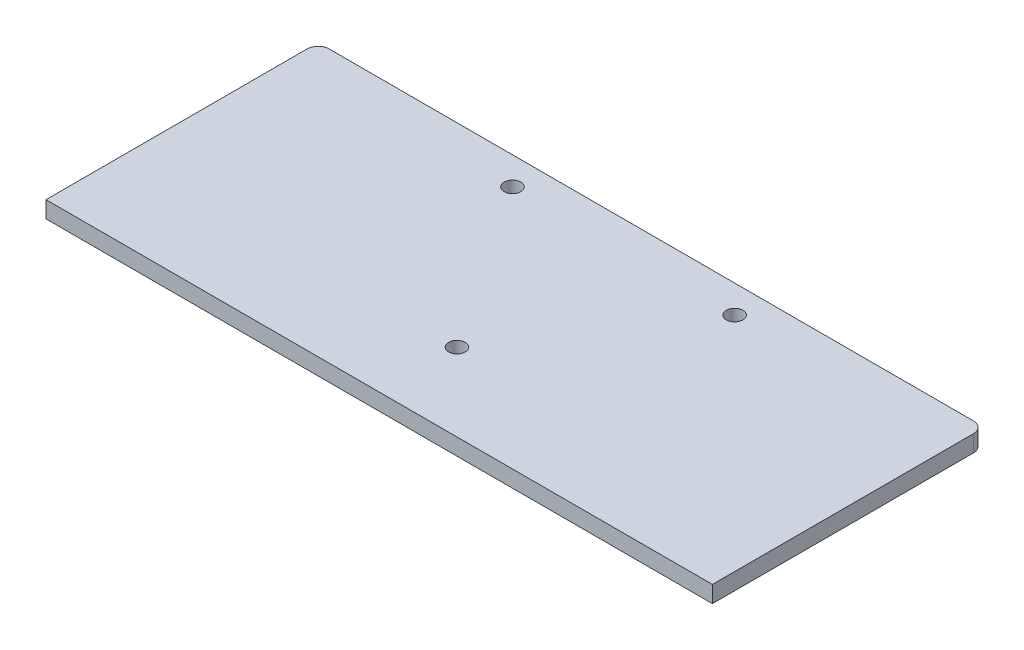
ISO-10303-21;
HEADER;
FILE_DESCRIPTION(('STEP AP214'),'2;1');
FILE_NAME('part.step','',(''),(''),'','','');
FILE_SCHEMA(('AUTOMOTIVE_DESIGN { 1 0 10303 214 1 1 1 1 }'));
ENDSEC;
DATA;
#1=APPLICATION_CONTEXT('core data for automotive mechanical design processes');
#2=APPLICATION_PROTOCOL_DEFINITION('international standard','automotive_design',2000,#1);
#3=PRODUCT_CONTEXT('',#1,'mechanical');
#4=PRODUCT('Part','Part','',(#3));
#5=PRODUCT_RELATED_PRODUCT_CATEGORY('part','',(#4));
#6=PRODUCT_DEFINITION_FORMATION('','',#4);
#7=PRODUCT_DEFINITION_CONTEXT('part definition',#1,'design');
#8=PRODUCT_DEFINITION('design','',#6,#7);
#9=PRODUCT_DEFINITION_SHAPE('','',#8);
#10=(LENGTH_UNIT() NAMED_UNIT(*) SI_UNIT(.MILLI.,.METRE.));
#11=(NAMED_UNIT(*) PLANE_ANGLE_UNIT() SI_UNIT($,.RADIAN.));
#12=(NAMED_UNIT(*) SI_UNIT($,.STERADIAN.) SOLID_ANGLE_UNIT());
#13=UNCERTAINTY_MEASURE_WITH_UNIT(LENGTH_MEASURE(1.E-05),#10,'distance_accuracy_value','');
#14=(GEOMETRIC_REPRESENTATION_CONTEXT(3) GLOBAL_UNCERTAINTY_ASSIGNED_CONTEXT((#13)) GLOBAL_UNIT_ASSIGNED_CONTEXT((#10,
#11,#12)) REPRESENTATION_CONTEXT('',''));
#15=CARTESIAN_POINT('',(0.,0.,0.));
#16=DIRECTION('',(0.,0.,1.));
#17=DIRECTION('',(1.,0.,0.));
#18=AXIS2_PLACEMENT_3D('',#15,#16,#17);
#19=CARTESIAN_POINT('',(-35.2816484848169,3.,-21.8846074327991));
#20=DIRECTION('',(1.,0.,0.));
#21=DIRECTION('',(0.,0.,-1.));
#22=AXIS2_PLACEMENT_3D('',#19,#20,#21);
#23=PLANE('',#22);
#24=DIRECTION('',(0.,0.,1.));
#25=VECTOR('',#24,1.);
#26=CARTESIAN_POINT('',(-35.2816484848169,3.,-21.8846074327991));
#27=LINE('',#26,#25);
#28=CARTESIAN_POINT('',(-35.2816484848169,3.,-19.8846074327991));
#29=VERTEX_POINT('',#28);
#30=CARTESIAN_POINT('',(-35.2816484848169,3.,27.1153925672009));
#31=VERTEX_POINT('',#30);
#32=EDGE_CURVE('E91',#29,#31,#27,.T.);
#33=ORIENTED_EDGE('',*,*,#32,.F.);
#34=DIRECTION('',(0.,-1.,0.));
#35=VECTOR('',#34,1.);
#36=CARTESIAN_POINT('',(-35.2816484848169,3.,-19.8846074327991));
#37=LINE('',#36,#35);
#38=CARTESIAN_POINT('',(-35.2816484848169,0.,-19.8846074327991));
#39=VERTEX_POINT('',#38);
#40=EDGE_CURVE('E11',#29,#39,#37,.T.);
#41=ORIENTED_EDGE('',*,*,#40,.T.);
#42=DIRECTION('',(0.,0.,1.));
#43=VECTOR('',#42,1.);
#44=CARTESIAN_POINT('',(-35.2816484848169,0.,-21.8846074327991));
#45=LINE('',#44,#43);
#46=CARTESIAN_POINT('',(-35.2816484848169,0.,27.1153925672009));
#47=VERTEX_POINT('',#46);
#48=EDGE_CURVE('E112',#39,#47,#45,.T.);
#49=ORIENTED_EDGE('',*,*,#48,.T.);
#50=DIRECTION('',(0.,-1.,0.));
#51=VECTOR('',#50,1.);
#52=CARTESIAN_POINT('',(-35.2816484848169,3.,27.1153925672009));
#53=LINE('',#52,#51);
#54=EDGE_CURVE('E105',#31,#47,#53,.T.);
#55=ORIENTED_EDGE('',*,*,#54,.F.);
#56=EDGE_LOOP('',(#33,#41,#49,#55));
#57=FACE_BOUND('',#56,.T.);
#58=ADVANCED_FACE('F37',(#57),#23,.F.);
#59=CARTESIAN_POINT('',(-35.2816484848169,3.,27.1153925672009));
#60=DIRECTION('',(0.,0.,-1.));
#61=DIRECTION('',(-1.,0.,0.));
#62=AXIS2_PLACEMENT_3D('',#59,#60,#61);
#63=PLANE('',#62);
#64=DIRECTION('',(1.,0.,0.));
#65=VECTOR('',#64,1.);
#66=CARTESIAN_POINT('',(-35.2816484848169,0.,27.1153925672009));
#67=LINE('',#66,#65);
#68=CARTESIAN_POINT('',(84.7183515151831,0.,27.1153925672009));
#69=VERTEX_POINT('',#68);
#70=EDGE_CURVE('E156',#47,#69,#67,.T.);
#71=ORIENTED_EDGE('',*,*,#70,.T.);
#72=DIRECTION('',(0.,-1.,0.));
#73=VECTOR('',#72,1.);
#74=CARTESIAN_POINT('',(84.7183515151831,3.,27.1153925672009));
#75=LINE('',#74,#73);
#76=CARTESIAN_POINT('',(84.7183515151831,3.,27.1153925672009));
#77=VERTEX_POINT('',#76);
#78=EDGE_CURVE('E107',#77,#69,#75,.T.);
#79=ORIENTED_EDGE('',*,*,#78,.F.);
#80=DIRECTION('',(1.,0.,0.));
#81=VECTOR('',#80,1.);
#82=CARTESIAN_POINT('',(-35.2816484848169,3.,27.1153925672009));
#83=LINE('',#82,#81);
#84=EDGE_CURVE('E94',#31,#77,#83,.T.);
#85=ORIENTED_EDGE('',*,*,#84,.F.);
#86=ORIENTED_EDGE('',*,*,#54,.T.);
#87=EDGE_LOOP('',(#71,#79,#85,#86));
#88=FACE_BOUND('',#87,.T.);
#89=ADVANCED_FACE('F104',(#88),#63,.F.);
#90=CARTESIAN_POINT('',(84.7183515151831,3.,-21.8846074327991));
#91=DIRECTION('',(-1.,0.,0.));
#92=DIRECTION('',(0.,0.,1.));
#93=AXIS2_PLACEMENT_3D('',#90,#91,#92);
#94=PLANE('',#93);
#95=DIRECTION('',(0.,0.,-1.));
#96=VECTOR('',#95,1.);
#97=CARTESIAN_POINT('',(84.7183515151831,0.,-21.8846074327991));
#98=LINE('',#97,#96);
#99=CARTESIAN_POINT('',(84.7183515151831,0.,-19.8846074327991));
#100=VERTEX_POINT('',#99);
#101=EDGE_CURVE('E153',#69,#100,#98,.T.);
#102=ORIENTED_EDGE('',*,*,#101,.T.);
#103=DIRECTION('',(0.,-1.,0.));
#104=VECTOR('',#103,1.);
#105=CARTESIAN_POINT('',(84.7183515151831,3.,-19.8846074327991));
#106=LINE('',#105,#104);
#107=CARTESIAN_POINT('',(84.7183515151831,3.,-19.8846074327991));
#108=VERTEX_POINT('',#107);
#109=EDGE_CURVE('E61',#100,#108,#106,.F.);
#110=ORIENTED_EDGE('',*,*,#109,.T.);
#111=DIRECTION('',(0.,0.,-1.));
#112=VECTOR('',#111,1.);
#113=CARTESIAN_POINT('',(84.7183515151831,3.,-21.8846074327991));
#114=LINE('',#113,#112);
#115=EDGE_CURVE('E109',#77,#108,#114,.T.);
#116=ORIENTED_EDGE('',*,*,#115,.F.);
#117=ORIENTED_EDGE('',*,*,#78,.T.);
#118=EDGE_LOOP('',(#102,#110,#116,#117));
#119=FACE_BOUND('',#118,.T.);
#120=ADVANCED_FACE('F154',(#119),#94,.F.);
#121=CARTESIAN_POINT('',(-35.2816484848169,3.,-21.8846074327991));
#122=DIRECTION('',(0.,0.,1.));
#123=DIRECTION('',(1.,0.,0.));
#124=AXIS2_PLACEMENT_3D('',#121,#122,#123);
#125=PLANE('',#124);
#126=DIRECTION('',(-1.,0.,0.));
#127=VECTOR('',#126,1.);
#128=CARTESIAN_POINT('',(-35.2816484848169,3.,-21.8846074327991));
#129=LINE('',#128,#127);
#130=CARTESIAN_POINT('',(82.7183515151831,3.,-21.8846074327991));
#131=VERTEX_POINT('',#130);
#132=CARTESIAN_POINT('',(-33.2816484848168,3.,-21.8846074327991));
#133=VERTEX_POINT('',#132);
#134=EDGE_CURVE('E121',#131,#133,#129,.T.);
#135=ORIENTED_EDGE('',*,*,#134,.F.);
#136=DIRECTION('',(0.,-1.,0.));
#137=VECTOR('',#136,1.);
#138=CARTESIAN_POINT('',(82.7183515151831,3.,-21.8846074327991));
#139=LINE('',#138,#137);
#140=CARTESIAN_POINT('',(82.7183515151831,0.,-21.8846074327991));
#141=VERTEX_POINT('',#140);
#142=EDGE_CURVE('E119',#131,#141,#139,.T.);
#143=ORIENTED_EDGE('',*,*,#142,.T.);
#144=DIRECTION('',(-1.,0.,0.));
#145=VECTOR('',#144,1.);
#146=CARTESIAN_POINT('',(-35.2816484848169,0.,-21.8846074327991));
#147=LINE('',#146,#145);
#148=CARTESIAN_POINT('',(-33.2816484848168,0.,-21.8846074327991));
#149=VERTEX_POINT('',#148);
#150=EDGE_CURVE('E100',#141,#149,#147,.T.);
#151=ORIENTED_EDGE('',*,*,#150,.T.);
#152=DIRECTION('',(0.,-1.,0.));
#153=VECTOR('',#152,1.);
#154=CARTESIAN_POINT('',(-33.2816484848168,3.,-21.8846074327991));
#155=LINE('',#154,#153);
#156=EDGE_CURVE('E115',#149,#133,#155,.F.);
#157=ORIENTED_EDGE('',*,*,#156,.T.);
#158=EDGE_LOOP('',(#135,#143,#151,#157));
#159=FACE_BOUND('',#158,.T.);
#160=ADVANCED_FACE('F143',(#159),#125,.F.);
#161=CARTESIAN_POINT('',(0.,3.,0.));
#162=DIRECTION('',(0.,1.,0.));
#163=DIRECTION('',(0.,0.,1.));
#164=AXIS2_PLACEMENT_3D('',#161,#162,#163);
#165=PLANE('',#164);
#166=CARTESIAN_POINT('',(4.71835151518315,3.,-16.8846074327991));
#167=DIRECTION('',(0.,1.,0.));
#168=DIRECTION('',(0.,0.,1.));
#169=AXIS2_PLACEMENT_3D('',#166,#167,#168);
#170=CIRCLE('',#169,1.5);
#171=CARTESIAN_POINT('',(4.71835151518315,3.,-15.3846074327991));
#172=VERTEX_POINT('',#171);
#173=EDGE_CURVE('E183',#172,#172,#170,.T.);
#174=ORIENTED_EDGE('',*,*,#173,.F.);
#175=EDGE_LOOP('',(#174));
#176=FACE_BOUND('',#175,.T.);
#177=CARTESIAN_POINT('',(44.7183515151831,3.,-16.8846074327991));
#178=DIRECTION('',(0.,1.,0.));
#179=DIRECTION('',(0.,0.,1.));
#180=AXIS2_PLACEMENT_3D('',#177,#178,#179);
#181=CIRCLE('',#180,1.50000000000002);
#182=CARTESIAN_POINT('',(44.7183515151831,3.,-15.384607432799));
#183=VERTEX_POINT('',#182);
#184=EDGE_CURVE('E175',#183,#183,#181,.T.);
#185=ORIENTED_EDGE('',*,*,#184,.F.);
#186=EDGE_LOOP('',(#185));
#187=FACE_BOUND('',#186,.T.);
#188=CARTESIAN_POINT('',(24.7183515151832,3.,13.1153925672009));
#189=DIRECTION('',(0.,1.,0.));
#190=DIRECTION('',(0.,0.,1.));
#191=AXIS2_PLACEMENT_3D('',#188,#189,#190);
#192=CIRCLE('',#191,1.5);
#193=CARTESIAN_POINT('',(24.7183515151832,3.,14.6153925672009));
#194=VERTEX_POINT('',#193);
#195=EDGE_CURVE('E167',#194,#194,#192,.T.);
#196=ORIENTED_EDGE('',*,*,#195,.F.);
#197=EDGE_LOOP('',(#196));
#198=FACE_BOUND('',#197,.T.);
#199=ORIENTED_EDGE('',*,*,#115,.T.);
#200=CARTESIAN_POINT('',(82.7183515151831,3.,-19.8846074327991));
#201=DIRECTION('',(0.,1.,0.));
#202=DIRECTION('',(0.,0.,1.));
#203=AXIS2_PLACEMENT_3D('',#200,#201,#202);
#204=CIRCLE('',#203,2.);
#205=EDGE_CURVE('E46',#108,#131,#204,.T.);
#206=ORIENTED_EDGE('',*,*,#205,.T.);
#207=ORIENTED_EDGE('',*,*,#134,.T.);
#208=CARTESIAN_POINT('',(-33.2816484848168,3.,-19.8846074327991));
#209=DIRECTION('',(0.,1.,0.));
#210=DIRECTION('',(0.,0.,1.));
#211=AXIS2_PLACEMENT_3D('',#208,#209,#210);
#212=CIRCLE('',#211,2.);
#213=EDGE_CURVE('E53',#133,#29,#212,.T.);
#214=ORIENTED_EDGE('',*,*,#213,.T.);
#215=ORIENTED_EDGE('',*,*,#32,.T.);
#216=ORIENTED_EDGE('',*,*,#84,.T.);
#217=EDGE_LOOP('',(#199,#206,#207,#214,#215,#216));
#218=FACE_BOUND('',#217,.T.);
#219=ADVANCED_FACE('F93',(#176,#187,#198,#218),#165,.T.);
#220=CARTESIAN_POINT('',(0.,0.,0.));
#221=DIRECTION('',(0.,1.,0.));
#222=DIRECTION('',(0.,0.,1.));
#223=AXIS2_PLACEMENT_3D('',#220,#221,#222);
#224=PLANE('',#223);
#225=CARTESIAN_POINT('',(4.71835151518315,0.,-16.8846074327991));
#226=DIRECTION('',(0.,1.,0.));
#227=DIRECTION('',(0.,0.,1.));
#228=AXIS2_PLACEMENT_3D('',#225,#226,#227);
#229=CIRCLE('',#228,1.5);
#230=CARTESIAN_POINT('',(4.71835151518315,0.,-15.3846074327991));
#231=VERTEX_POINT('',#230);
#232=EDGE_CURVE('E163',#231,#231,#229,.T.);
#233=ORIENTED_EDGE('',*,*,#232,.T.);
#234=EDGE_LOOP('',(#233));
#235=FACE_BOUND('',#234,.T.);
#236=CARTESIAN_POINT('',(44.7183515151831,0.,-16.8846074327991));
#237=DIRECTION('',(0.,1.,0.));
#238=DIRECTION('',(0.,0.,1.));
#239=AXIS2_PLACEMENT_3D('',#236,#237,#238);
#240=CIRCLE('',#239,1.50000000000002);
#241=CARTESIAN_POINT('',(44.7183515151831,0.,-15.384607432799));
#242=VERTEX_POINT('',#241);
#243=EDGE_CURVE('E179',#242,#242,#240,.T.);
#244=ORIENTED_EDGE('',*,*,#243,.T.);
#245=EDGE_LOOP('',(#244));
#246=FACE_BOUND('',#245,.T.);
#247=CARTESIAN_POINT('',(24.7183515151832,0.,13.1153925672009));
#248=DIRECTION('',(0.,1.,0.));
#249=DIRECTION('',(0.,0.,1.));
#250=AXIS2_PLACEMENT_3D('',#247,#248,#249);
#251=CIRCLE('',#250,1.5);
#252=CARTESIAN_POINT('',(24.7183515151832,0.,14.6153925672009));
#253=VERTEX_POINT('',#252);
#254=EDGE_CURVE('E171',#253,#253,#251,.T.);
#255=ORIENTED_EDGE('',*,*,#254,.T.);
#256=EDGE_LOOP('',(#255));
#257=FACE_BOUND('',#256,.T.);
#258=ORIENTED_EDGE('',*,*,#150,.F.);
#259=CARTESIAN_POINT('',(82.7183515151831,0.,-19.8846074327991));
#260=DIRECTION('',(0.,1.,0.));
#261=DIRECTION('',(0.,0.,1.));
#262=AXIS2_PLACEMENT_3D('',#259,#260,#261);
#263=CIRCLE('',#262,2.);
#264=EDGE_CURVE('E131',#141,#100,#263,.F.);
#265=ORIENTED_EDGE('',*,*,#264,.T.);
#266=ORIENTED_EDGE('',*,*,#101,.F.);
#267=ORIENTED_EDGE('',*,*,#70,.F.);
#268=ORIENTED_EDGE('',*,*,#48,.F.);
#269=CARTESIAN_POINT('',(-33.2816484848168,0.,-19.8846074327991));
#270=DIRECTION('',(0.,1.,0.));
#271=DIRECTION('',(0.,0.,1.));
#272=AXIS2_PLACEMENT_3D('',#269,#270,#271);
#273=CIRCLE('',#272,2.);
#274=EDGE_CURVE('E128',#39,#149,#273,.F.);
#275=ORIENTED_EDGE('',*,*,#274,.T.);
#276=EDGE_LOOP('',(#258,#265,#266,#267,#268,#275));
#277=FACE_BOUND('',#276,.T.);
#278=ADVANCED_FACE('F152',(#235,#246,#257,#277),#224,.F.);
#279=CARTESIAN_POINT('',(24.7183515151832,0.,13.1153925672009));
#280=DIRECTION('',(0.,1.,0.));
#281=DIRECTION('',(0.,0.,1.));
#282=AXIS2_PLACEMENT_3D('',#279,#280,#281);
#283=CYLINDRICAL_SURFACE('',#282,1.5);
#284=ORIENTED_EDGE('',*,*,#254,.F.);
#285=EDGE_LOOP('',(#284));
#286=FACE_BOUND('',#285,.T.);
#287=ORIENTED_EDGE('',*,*,#195,.T.);
#288=EDGE_LOOP('',(#287));
#289=FACE_BOUND('',#288,.T.);
#290=ADVANCED_FACE('F207',(#286,#289),#283,.F.);
#291=CARTESIAN_POINT('',(44.7183515151831,0.,-16.8846074327991));
#292=DIRECTION('',(0.,1.,0.));
#293=DIRECTION('',(0.,0.,1.));
#294=AXIS2_PLACEMENT_3D('',#291,#292,#293);
#295=CYLINDRICAL_SURFACE('',#294,1.50000000000002);
#296=ORIENTED_EDGE('',*,*,#243,.F.);
#297=EDGE_LOOP('',(#296));
#298=FACE_BOUND('',#297,.T.);
#299=ORIENTED_EDGE('',*,*,#184,.T.);
#300=EDGE_LOOP('',(#299));
#301=FACE_BOUND('',#300,.T.);
#302=ADVANCED_FACE('F196',(#298,#301),#295,.F.);
#303=CARTESIAN_POINT('',(4.71835151518315,0.,-16.8846074327991));
#304=DIRECTION('',(0.,1.,0.));
#305=DIRECTION('',(0.,0.,1.));
#306=AXIS2_PLACEMENT_3D('',#303,#304,#305);
#307=CYLINDRICAL_SURFACE('',#306,1.5);
#308=ORIENTED_EDGE('',*,*,#232,.F.);
#309=EDGE_LOOP('',(#308));
#310=FACE_BOUND('',#309,.T.);
#311=ORIENTED_EDGE('',*,*,#173,.T.);
#312=EDGE_LOOP('',(#311));
#313=FACE_BOUND('',#312,.T.);
#314=ADVANCED_FACE('F193',(#310,#313),#307,.F.);
#315=CARTESIAN_POINT('',(82.7183515151831,3.,-19.8846074327991));
#316=DIRECTION('',(0.,-1.,0.));
#317=DIRECTION('',(0.,0.,-1.));
#318=AXIS2_PLACEMENT_3D('',#315,#316,#317);
#319=CYLINDRICAL_SURFACE('',#318,2.);
#320=ORIENTED_EDGE('',*,*,#205,.F.);
#321=ORIENTED_EDGE('',*,*,#109,.F.);
#322=ORIENTED_EDGE('',*,*,#264,.F.);
#323=ORIENTED_EDGE('',*,*,#142,.F.);
#324=EDGE_LOOP('',(#320,#321,#322,#323));
#325=FACE_BOUND('',#324,.T.);
#326=ADVANCED_FACE('F149',(#325),#319,.T.);
#327=CARTESIAN_POINT('',(-33.2816484848168,3.,-19.8846074327991));
#328=DIRECTION('',(0.,-1.,0.));
#329=DIRECTION('',(0.,0.,-1.));
#330=AXIS2_PLACEMENT_3D('',#327,#328,#329);
#331=CYLINDRICAL_SURFACE('',#330,2.);
#332=ORIENTED_EDGE('',*,*,#213,.F.);
#333=ORIENTED_EDGE('',*,*,#156,.F.);
#334=ORIENTED_EDGE('',*,*,#274,.F.);
#335=ORIENTED_EDGE('',*,*,#40,.F.);
#336=EDGE_LOOP('',(#332,#333,#334,#335));
#337=FACE_BOUND('',#336,.T.);
#338=ADVANCED_FACE('F39',(#337),#331,.T.);
#339=CLOSED_SHELL('',(#58,#89,#120,#160,#219,#278,#290,#302,#314,#326,#338));
#340=MANIFOLD_SOLID_BREP('B2',#339);
#341=ADVANCED_BREP_SHAPE_REPRESENTATION('',(#18,#340),#14);
#342=SHAPE_DEFINITION_REPRESENTATION(#9,#341);
ENDSEC;
END-ISO-10303-21;
